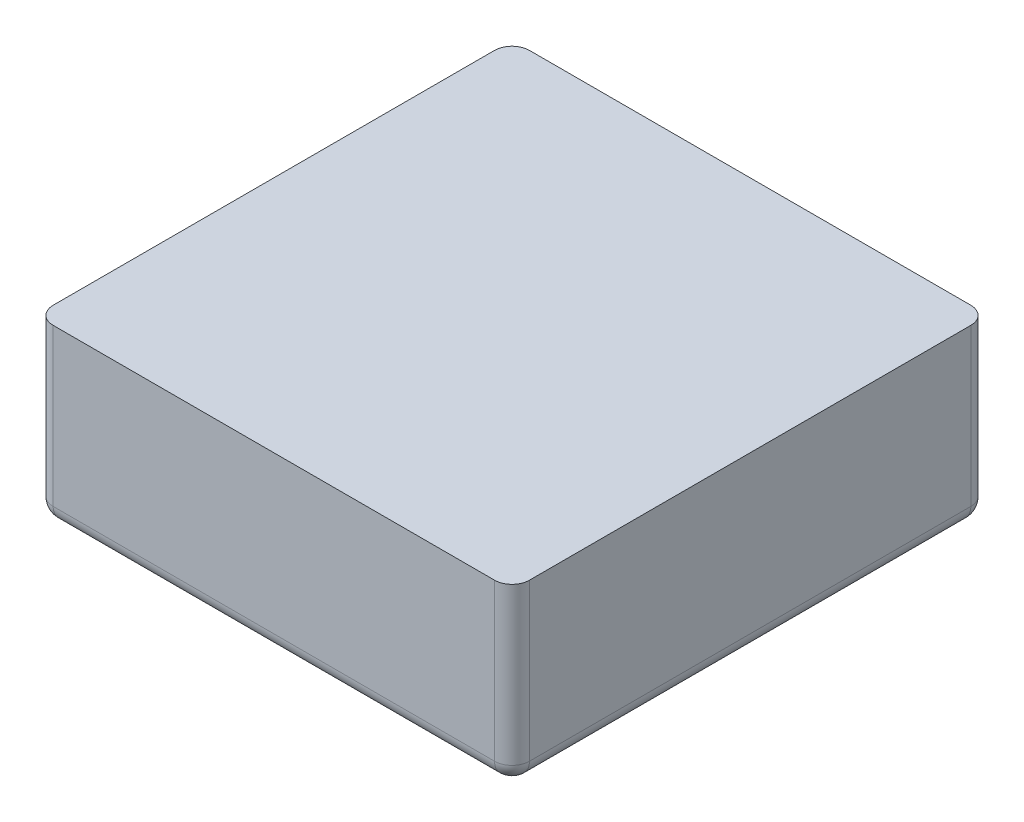
ISO-10303-21;
HEADER;
FILE_DESCRIPTION(('STEP AP214'),'2;1');
FILE_NAME('part.step','',(''),(''),'','','');
FILE_SCHEMA(('AUTOMOTIVE_DESIGN { 1 0 10303 214 1 1 1 1 }'));
ENDSEC;
DATA;
#1=APPLICATION_CONTEXT('core data for automotive mechanical design processes');
#2=APPLICATION_PROTOCOL_DEFINITION('international standard','automotive_design',2000,#1);
#3=PRODUCT_CONTEXT('',#1,'mechanical');
#4=PRODUCT('Part','Part','',(#3));
#5=PRODUCT_RELATED_PRODUCT_CATEGORY('part','',(#4));
#6=PRODUCT_DEFINITION_FORMATION('','',#4);
#7=PRODUCT_DEFINITION_CONTEXT('part definition',#1,'design');
#8=PRODUCT_DEFINITION('design','',#6,#7);
#9=PRODUCT_DEFINITION_SHAPE('','',#8);
#10=(LENGTH_UNIT() NAMED_UNIT(*) SI_UNIT(.MILLI.,.METRE.));
#11=(NAMED_UNIT(*) PLANE_ANGLE_UNIT() SI_UNIT($,.RADIAN.));
#12=(NAMED_UNIT(*) SI_UNIT($,.STERADIAN.) SOLID_ANGLE_UNIT());
#13=UNCERTAINTY_MEASURE_WITH_UNIT(LENGTH_MEASURE(1.E-05),#10,'distance_accuracy_value','');
#14=(GEOMETRIC_REPRESENTATION_CONTEXT(3) GLOBAL_UNCERTAINTY_ASSIGNED_CONTEXT((#13)) GLOBAL_UNIT_ASSIGNED_CONTEXT((#10,
#11,#12)) REPRESENTATION_CONTEXT('',''));
#15=CARTESIAN_POINT('',(0.,0.,0.));
#16=DIRECTION('',(0.,0.,1.));
#17=DIRECTION('',(1.,0.,0.));
#18=AXIS2_PLACEMENT_3D('',#15,#16,#17);
#19=CARTESIAN_POINT('',(37.8184373942661,11.45007019043,0.02539998851717));
#20=DIRECTION('',(4.371138828674E-08,-1.,0.));
#21=DIRECTION('',(1.,4.371138828674E-08,0.));
#22=AXIS2_PLACEMENT_3D('',#19,#20,#21);
#23=PLANE('',#22);
#24=DIRECTION('',(0.,0.,-1.));
#25=VECTOR('',#24,1.);
#26=CARTESIAN_POINT('',(38.1984373942661,11.4500702070403,0.805399988517169));
#27=LINE('',#26,#25);
#28=CARTESIAN_POINT('',(38.1984373942661,11.4500702070403,0.805399988517169));
#29=VERTEX_POINT('',#28);
#30=CARTESIAN_POINT('',(38.1984373942661,11.4500702070403,0.04539998851717));
#31=VERTEX_POINT('',#30);
#32=EDGE_CURVE('E169',#29,#31,#27,.T.);
#33=ORIENTED_EDGE('',*,*,#32,.F.);
#34=DIRECTION('',(1.,4.371138828674E-08,0.));
#35=VECTOR('',#34,1.);
#36=CARTESIAN_POINT('',(37.4384373942661,11.4500701738197,0.805399988517169));
#37=LINE('',#36,#35);
#38=CARTESIAN_POINT('',(37.4384373942661,11.4500701738197,0.805399988517169));
#39=VERTEX_POINT('',#38);
#40=EDGE_CURVE('E25',#39,#29,#37,.T.);
#41=ORIENTED_EDGE('',*,*,#40,.F.);
#42=DIRECTION('',(0.,0.,1.));
#43=VECTOR('',#42,1.);
#44=CARTESIAN_POINT('',(37.4384373942661,11.4500701738197,0.04539998851717));
#45=LINE('',#44,#43);
#46=CARTESIAN_POINT('',(37.4384373942661,11.4500701738197,0.04539998851717));
#47=VERTEX_POINT('',#46);
#48=EDGE_CURVE('E182',#47,#39,#45,.T.);
#49=ORIENTED_EDGE('',*,*,#48,.F.);
#50=DIRECTION('',(-1.,-4.371138828674E-08,0.));
#51=VECTOR('',#50,1.);
#52=CARTESIAN_POINT('',(38.1984373942661,11.4500702070403,0.04539998851717));
#53=LINE('',#52,#51);
#54=EDGE_CURVE('E189',#31,#47,#53,.T.);
#55=ORIENTED_EDGE('',*,*,#54,.F.);
#56=EDGE_LOOP('',(#33,#41,#49,#55));
#57=FACE_BOUND('',#56,.T.);
#58=ADVANCED_FACE('F16',(#57),#23,.T.);
#59=CARTESIAN_POINT('',(38.2284373942661,11.4500702083517,0.835399988517169));
#60=DIRECTION('',(0.,0.,-1.));
#61=DIRECTION('',(4.371138828674E-08,-1.,0.));
#62=AXIS2_PLACEMENT_3D('',#59,#60,#61);
#63=PLANE('',#62);
#64=DIRECTION('',(-4.371138828674E-08,1.,0.));
#65=VECTOR('',#64,1.);
#66=CARTESIAN_POINT('',(37.4384373929548,11.4800701738197,0.835399988517169));
#67=LINE('',#66,#65);
#68=CARTESIAN_POINT('',(37.4384373929548,11.4800701738197,0.835399988517169));
#69=VERTEX_POINT('',#68);
#70=CARTESIAN_POINT('',(37.4384373811526,11.7500701738197,0.835399988517169));
#71=VERTEX_POINT('',#70);
#72=EDGE_CURVE('E127',#69,#71,#67,.T.);
#73=ORIENTED_EDGE('',*,*,#72,.F.);
#74=DIRECTION('',(-1.,-4.371138828674E-08,0.));
#75=VECTOR('',#74,1.);
#76=CARTESIAN_POINT('',(38.1984373929547,11.4800702070403,0.835399988517169));
#77=LINE('',#76,#75);
#78=CARTESIAN_POINT('',(38.1984373929547,11.4800702070403,0.835399988517169));
#79=VERTEX_POINT('',#78);
#80=EDGE_CURVE('E11',#79,#69,#77,.T.);
#81=ORIENTED_EDGE('',*,*,#80,.F.);
#82=DIRECTION('',(4.371138828674E-08,-1.,0.));
#83=VECTOR('',#82,1.);
#84=CARTESIAN_POINT('',(38.1984373811526,11.7500702070403,0.835399988517169));
#85=LINE('',#84,#83);
#86=CARTESIAN_POINT('',(38.1984373811526,11.7500702070403,0.835399988517169));
#87=VERTEX_POINT('',#86);
#88=EDGE_CURVE('E129',#87,#79,#85,.T.);
#89=ORIENTED_EDGE('',*,*,#88,.F.);
#90=DIRECTION('',(1.,4.371138828674E-08,0.));
#91=VECTOR('',#90,1.);
#92=CARTESIAN_POINT('',(37.4384373811526,11.7500701738197,0.835399988517169));
#93=LINE('',#92,#91);
#94=EDGE_CURVE('E123',#71,#87,#93,.T.);
#95=ORIENTED_EDGE('',*,*,#94,.F.);
#96=EDGE_LOOP('',(#73,#81,#89,#95));
#97=FACE_BOUND('',#96,.T.);
#98=ADVANCED_FACE('F125',(#97),#63,.F.);
#99=CARTESIAN_POINT('',(37.8184373929547,11.48007019043,0.805399988517169));
#100=DIRECTION('',(1.,4.371138828674E-08,0.));
#101=DIRECTION('',(-4.371138828674E-08,1.,0.));
#102=AXIS2_PLACEMENT_3D('',#99,#100,#101);
#103=CYLINDRICAL_SURFACE('',#102,0.03);
#104=ORIENTED_EDGE('',*,*,#40,.T.);
#105=CARTESIAN_POINT('',(38.1984373929547,11.4800702070403,0.805399988517169));
#106=DIRECTION('',(1.,4.371138828674E-08,0.));
#107=DIRECTION('',(0.,0.,1.));
#108=AXIS2_PLACEMENT_3D('',#105,#106,#107);
#109=CIRCLE('',#108,0.03);
#110=EDGE_CURVE('E179',#79,#29,#109,.T.);
#111=ORIENTED_EDGE('',*,*,#110,.F.);
#112=ORIENTED_EDGE('',*,*,#80,.T.);
#113=CARTESIAN_POINT('',(37.4384373929548,11.4800701738197,0.805399988517169));
#114=DIRECTION('',(-1.,-4.371138828674E-08,0.));
#115=DIRECTION('',(4.371138828674E-08,-1.,0.));
#116=AXIS2_PLACEMENT_3D('',#113,#114,#115);
#117=CIRCLE('',#116,0.03);
#118=EDGE_CURVE('E263',#39,#69,#117,.T.);
#119=ORIENTED_EDGE('',*,*,#118,.F.);
#120=EDGE_LOOP('',(#104,#111,#112,#119));
#121=FACE_BOUND('',#120,.T.);
#122=ADVANCED_FACE('F343',(#121),#103,.T.);
#123=CARTESIAN_POINT('',(38.1984373929547,11.4800702070403,0.805399988517169));
#124=DIRECTION('',(-1.,-4.371138828674E-08,0.));
#125=DIRECTION('',(-4.371138828674E-08,1.,0.));
#126=AXIS2_PLACEMENT_3D('',#123,#124,#125);
#127=SPHERICAL_SURFACE('',#126,0.03);
#128=ORIENTED_EDGE('',*,*,#110,.T.);
#129=CARTESIAN_POINT('',(38.1984373929547,11.4800702070403,0.805399988517169));
#130=DIRECTION('',(0.,0.,1.));
#131=DIRECTION('',(4.371138828674E-08,-1.,0.));
#132=AXIS2_PLACEMENT_3D('',#129,#130,#131);
#133=CIRCLE('',#132,0.03);
#134=CARTESIAN_POINT('',(38.2284373929547,11.4800702083517,0.805399988517169));
#135=VERTEX_POINT('',#134);
#136=EDGE_CURVE('E174',#29,#135,#133,.T.);
#137=ORIENTED_EDGE('',*,*,#136,.T.);
#138=CARTESIAN_POINT('',(38.1984373929547,11.4800702070403,0.805399988517169));
#139=DIRECTION('',(4.371138828674E-08,-1.,0.));
#140=DIRECTION('',(1.,4.371138828674E-08,0.));
#141=AXIS2_PLACEMENT_3D('',#138,#139,#140);
#142=CIRCLE('',#141,0.03);
#143=EDGE_CURVE('E85',#135,#79,#142,.T.);
#144=ORIENTED_EDGE('',*,*,#143,.T.);
#145=EDGE_LOOP('',(#128,#137,#144));
#146=FACE_BOUND('',#145,.T.);
#147=ADVANCED_FACE('F353',(#146),#127,.T.);
#148=CARTESIAN_POINT('',(38.1984373942661,11.4500702070403,0.805399988517169));
#149=DIRECTION('',(-4.371138828674E-08,1.,0.));
#150=DIRECTION('',(-1.,-4.371138828674E-08,0.));
#151=AXIS2_PLACEMENT_3D('',#148,#149,#150);
#152=CYLINDRICAL_SURFACE('',#151,0.03);
#153=ORIENTED_EDGE('',*,*,#88,.T.);
#154=ORIENTED_EDGE('',*,*,#143,.F.);
#155=DIRECTION('',(-4.371138828674E-08,1.,0.));
#156=VECTOR('',#155,1.);
#157=CARTESIAN_POINT('',(38.2284373929547,11.4800702083517,0.805399988517169));
#158=LINE('',#157,#156);
#159=CARTESIAN_POINT('',(38.2284373811526,11.7500702083517,0.805399988517169));
#160=VERTEX_POINT('',#159);
#161=EDGE_CURVE('E242',#135,#160,#158,.T.);
#162=ORIENTED_EDGE('',*,*,#161,.T.);
#163=CARTESIAN_POINT('',(38.1984373811526,11.7500702070403,0.805399988517169));
#164=DIRECTION('',(-4.371138828674E-08,1.,0.));
#165=DIRECTION('',(0.,0.,1.));
#166=AXIS2_PLACEMENT_3D('',#163,#164,#165);
#167=CIRCLE('',#166,0.03);
#168=EDGE_CURVE('E133',#87,#160,#167,.T.);
#169=ORIENTED_EDGE('',*,*,#168,.F.);
#170=EDGE_LOOP('',(#153,#154,#162,#169));
#171=FACE_BOUND('',#170,.T.);
#172=ADVANCED_FACE('F359',(#171),#152,.T.);
#173=CARTESIAN_POINT('',(38.1984373942661,11.4500702070403,0.04539998851717));
#174=DIRECTION('',(-4.371138828674E-08,1.,0.));
#175=DIRECTION('',(-1.,-4.371138828674E-08,0.));
#176=AXIS2_PLACEMENT_3D('',#173,#174,#175);
#177=CYLINDRICAL_SURFACE('',#176,0.03);
#178=DIRECTION('',(4.371138828674E-08,-1.,0.));
#179=VECTOR('',#178,1.);
#180=CARTESIAN_POINT('',(38.2284373811526,11.7500702083517,0.04539998851717));
#181=LINE('',#180,#179);
#182=CARTESIAN_POINT('',(38.2284373811526,11.7500702083517,0.04539998851717));
#183=VERTEX_POINT('',#182);
#184=CARTESIAN_POINT('',(38.2284373929547,11.4800702083517,0.04539998851717));
#185=VERTEX_POINT('',#184);
#186=EDGE_CURVE('E218',#183,#185,#181,.T.);
#187=ORIENTED_EDGE('',*,*,#186,.T.);
#188=CARTESIAN_POINT('',(38.1984373929547,11.4800702070403,0.04539998851717));
#189=DIRECTION('',(4.371138828674E-08,-1.,0.));
#190=DIRECTION('',(0.,0.,-1.));
#191=AXIS2_PLACEMENT_3D('',#188,#189,#190);
#192=CIRCLE('',#191,0.03);
#193=CARTESIAN_POINT('',(38.1984373929547,11.4800702070403,0.01539998851717));
#194=VERTEX_POINT('',#193);
#195=EDGE_CURVE('E210',#194,#185,#192,.T.);
#196=ORIENTED_EDGE('',*,*,#195,.F.);
#197=DIRECTION('',(-4.371138828674E-08,1.,0.));
#198=VECTOR('',#197,1.);
#199=CARTESIAN_POINT('',(38.1984373929547,11.4800702070403,0.01539998851717));
#200=LINE('',#199,#198);
#201=CARTESIAN_POINT('',(38.1984373811526,11.7500702070403,0.01539998851717));
#202=VERTEX_POINT('',#201);
#203=EDGE_CURVE('E164',#194,#202,#200,.T.);
#204=ORIENTED_EDGE('',*,*,#203,.T.);
#205=CARTESIAN_POINT('',(38.1984373811526,11.7500702070403,0.04539998851717));
#206=DIRECTION('',(-4.371138828674E-08,1.,0.));
#207=DIRECTION('',(1.,4.371138828674E-08,0.));
#208=AXIS2_PLACEMENT_3D('',#205,#206,#207);
#209=CIRCLE('',#208,0.03);
#210=EDGE_CURVE('E235',#183,#202,#209,.T.);
#211=ORIENTED_EDGE('',*,*,#210,.F.);
#212=EDGE_LOOP('',(#187,#196,#204,#211));
#213=FACE_BOUND('',#212,.T.);
#214=ADVANCED_FACE('F336',(#213),#177,.T.);
#215=CARTESIAN_POINT('',(37.4084373942661,11.4500701725083,0.01539998851717));
#216=DIRECTION('',(0.,0.,1.));
#217=DIRECTION('',(-4.371138828674E-08,1.,0.));
#218=AXIS2_PLACEMENT_3D('',#215,#216,#217);
#219=PLANE('',#218);
#220=DIRECTION('',(4.371138828674E-08,-1.,0.));
#221=VECTOR('',#220,1.);
#222=CARTESIAN_POINT('',(37.4384373811526,11.7500701738197,0.01539998851717));
#223=LINE('',#222,#221);
#224=CARTESIAN_POINT('',(37.4384373811526,11.7500701738197,0.01539998851717));
#225=VERTEX_POINT('',#224);
#226=CARTESIAN_POINT('',(37.4384373929548,11.4800701738197,0.01539998851717));
#227=VERTEX_POINT('',#226);
#228=EDGE_CURVE('E232',#225,#227,#223,.T.);
#229=ORIENTED_EDGE('',*,*,#228,.F.);
#230=DIRECTION('',(-1.,-4.371138828674E-08,0.));
#231=VECTOR('',#230,1.);
#232=CARTESIAN_POINT('',(38.1984373811526,11.7500702070403,0.01539998851717));
#233=LINE('',#232,#231);
#234=EDGE_CURVE('E239',#202,#225,#233,.T.);
#235=ORIENTED_EDGE('',*,*,#234,.F.);
#236=ORIENTED_EDGE('',*,*,#203,.F.);
#237=DIRECTION('',(1.,4.371138828674E-08,0.));
#238=VECTOR('',#237,1.);
#239=CARTESIAN_POINT('',(37.4384373929548,11.4800701738197,0.01539998851717));
#240=LINE('',#239,#238);
#241=EDGE_CURVE('E193',#227,#194,#240,.T.);
#242=ORIENTED_EDGE('',*,*,#241,.F.);
#243=EDGE_LOOP('',(#229,#235,#236,#242));
#244=FACE_BOUND('',#243,.T.);
#245=ADVANCED_FACE('F324',(#244),#219,.F.);
#246=CARTESIAN_POINT('',(37.4384373942661,11.4500701738197,0.04539998851717));
#247=DIRECTION('',(-4.371138828674E-08,1.,0.));
#248=DIRECTION('',(-1.,-4.371138828674E-08,0.));
#249=AXIS2_PLACEMENT_3D('',#246,#247,#248);
#250=CYLINDRICAL_SURFACE('',#249,0.03);
#251=ORIENTED_EDGE('',*,*,#228,.T.);
#252=CARTESIAN_POINT('',(37.4384373929548,11.4800701738197,0.04539998851717));
#253=DIRECTION('',(4.371138828674E-08,-1.,0.));
#254=DIRECTION('',(-1.,-4.371138828674E-08,0.));
#255=AXIS2_PLACEMENT_3D('',#252,#253,#254);
#256=CIRCLE('',#255,0.03);
#257=CARTESIAN_POINT('',(37.4084373929547,11.4800701725083,0.04539998851717));
#258=VERTEX_POINT('',#257);
#259=EDGE_CURVE('E201',#258,#227,#256,.T.);
#260=ORIENTED_EDGE('',*,*,#259,.F.);
#261=DIRECTION('',(-4.371138828674E-08,1.,0.));
#262=VECTOR('',#261,1.);
#263=CARTESIAN_POINT('',(37.4084373929547,11.4800701725083,0.04539998851717));
#264=LINE('',#263,#262);
#265=CARTESIAN_POINT('',(37.4084373811526,11.7500701725083,0.04539998851717));
#266=VERTEX_POINT('',#265);
#267=EDGE_CURVE('E46',#258,#266,#264,.T.);
#268=ORIENTED_EDGE('',*,*,#267,.T.);
#269=CARTESIAN_POINT('',(37.4384373811526,11.7500701738197,0.04539998851717));
#270=DIRECTION('',(-4.371138828674E-08,1.,0.));
#271=DIRECTION('',(0.,0.,-1.));
#272=AXIS2_PLACEMENT_3D('',#269,#270,#271);
#273=CIRCLE('',#272,0.03);
#274=EDGE_CURVE('E293',#225,#266,#273,.T.);
#275=ORIENTED_EDGE('',*,*,#274,.F.);
#276=EDGE_LOOP('',(#251,#260,#268,#275));
#277=FACE_BOUND('',#276,.T.);
#278=ADVANCED_FACE('F325',(#277),#250,.T.);
#279=CARTESIAN_POINT('',(37.4084373942661,11.4500701725083,0.835399988517169));
#280=DIRECTION('',(1.,4.371138828674E-08,0.));
#281=DIRECTION('',(-4.371138828674E-08,1.,0.));
#282=AXIS2_PLACEMENT_3D('',#279,#280,#281);
#283=PLANE('',#282);
#284=DIRECTION('',(4.371138828674E-08,-1.,0.));
#285=VECTOR('',#284,1.);
#286=CARTESIAN_POINT('',(37.4084373811526,11.7500701725083,0.805399988517169));
#287=LINE('',#286,#285);
#288=CARTESIAN_POINT('',(37.4084373811526,11.7500701725083,0.805399988517169));
#289=VERTEX_POINT('',#288);
#290=CARTESIAN_POINT('',(37.4084373929547,11.4800701725083,0.805399988517169));
#291=VERTEX_POINT('',#290);
#292=EDGE_CURVE('E149',#289,#291,#287,.T.);
#293=ORIENTED_EDGE('',*,*,#292,.F.);
#294=DIRECTION('',(0.,0.,1.));
#295=VECTOR('',#294,1.);
#296=CARTESIAN_POINT('',(37.4084373811526,11.7500701725083,0.04539998851717));
#297=LINE('',#296,#295);
#298=EDGE_CURVE('E139',#266,#289,#297,.T.);
#299=ORIENTED_EDGE('',*,*,#298,.F.);
#300=ORIENTED_EDGE('',*,*,#267,.F.);
#301=DIRECTION('',(0.,0.,-1.));
#302=VECTOR('',#301,1.);
#303=CARTESIAN_POINT('',(37.4084373929547,11.4800701725083,0.805399988517169));
#304=LINE('',#303,#302);
#305=EDGE_CURVE('E187',#291,#258,#304,.T.);
#306=ORIENTED_EDGE('',*,*,#305,.F.);
#307=EDGE_LOOP('',(#293,#299,#300,#306));
#308=FACE_BOUND('',#307,.T.);
#309=ADVANCED_FACE('F327',(#308),#283,.F.);
#310=CARTESIAN_POINT('',(37.8184373811526,11.75007019043,0.02539998851717));
#311=DIRECTION('',(4.371138828674E-08,-1.,0.));
#312=DIRECTION('',(1.,4.371138828674E-08,0.));
#313=AXIS2_PLACEMENT_3D('',#310,#311,#312);
#314=PLANE('',#313);
#315=CARTESIAN_POINT('',(37.4384373811526,11.7500701738197,0.805399988517169));
#316=DIRECTION('',(-4.371138828674E-08,1.,0.));
#317=DIRECTION('',(-1.,-4.371138828674E-08,0.));
#318=AXIS2_PLACEMENT_3D('',#315,#316,#317);
#319=CIRCLE('',#318,0.03);
#320=EDGE_CURVE('E134',#289,#71,#319,.T.);
#321=ORIENTED_EDGE('',*,*,#320,.T.);
#322=ORIENTED_EDGE('',*,*,#94,.T.);
#323=ORIENTED_EDGE('',*,*,#168,.T.);
#324=DIRECTION('',(0.,0.,-1.));
#325=VECTOR('',#324,1.);
#326=CARTESIAN_POINT('',(38.2284373811526,11.7500702083517,0.805399988517169));
#327=LINE('',#326,#325);
#328=EDGE_CURVE('E222',#160,#183,#327,.T.);
#329=ORIENTED_EDGE('',*,*,#328,.T.);
#330=ORIENTED_EDGE('',*,*,#210,.T.);
#331=ORIENTED_EDGE('',*,*,#234,.T.);
#332=ORIENTED_EDGE('',*,*,#274,.T.);
#333=ORIENTED_EDGE('',*,*,#298,.T.);
#334=EDGE_LOOP('',(#321,#322,#323,#329,#330,#331,#332,#333));
#335=FACE_BOUND('',#334,.T.);
#336=ADVANCED_FACE('F137',(#335),#314,.F.);
#337=CARTESIAN_POINT('',(37.4384373942661,11.4500701738197,0.805399988517169));
#338=DIRECTION('',(-4.371138828674E-08,1.,0.));
#339=DIRECTION('',(-1.,-4.371138828674E-08,0.));
#340=AXIS2_PLACEMENT_3D('',#337,#338,#339);
#341=CYLINDRICAL_SURFACE('',#340,0.03);
#342=ORIENTED_EDGE('',*,*,#292,.T.);
#343=CARTESIAN_POINT('',(37.4384373929548,11.4800701738197,0.805399988517169));
#344=DIRECTION('',(4.371138828674E-08,-1.,0.));
#345=DIRECTION('',(0.,0.,1.));
#346=AXIS2_PLACEMENT_3D('',#343,#344,#345);
#347=CIRCLE('',#346,0.03);
#348=EDGE_CURVE('E146',#69,#291,#347,.T.);
#349=ORIENTED_EDGE('',*,*,#348,.F.);
#350=ORIENTED_EDGE('',*,*,#72,.T.);
#351=ORIENTED_EDGE('',*,*,#320,.F.);
#352=EDGE_LOOP('',(#342,#349,#350,#351));
#353=FACE_BOUND('',#352,.T.);
#354=ADVANCED_FACE('F144',(#353),#341,.T.);
#355=CARTESIAN_POINT('',(37.4384373929548,11.4800701738197,0.805399988517169));
#356=DIRECTION('',(-1.,-4.371138828674E-08,0.));
#357=DIRECTION('',(-4.371138828674E-08,1.,0.));
#358=AXIS2_PLACEMENT_3D('',#355,#356,#357);
#359=SPHERICAL_SURFACE('',#358,0.03);
#360=CARTESIAN_POINT('',(37.4384373929548,11.4800701738197,0.805399988517169));
#361=DIRECTION('',(0.,0.,1.));
#362=DIRECTION('',(-1.,-4.371138828674E-08,0.));
#363=AXIS2_PLACEMENT_3D('',#360,#361,#362);
#364=CIRCLE('',#363,0.03);
#365=EDGE_CURVE('E186',#291,#39,#364,.T.);
#366=ORIENTED_EDGE('',*,*,#365,.T.);
#367=ORIENTED_EDGE('',*,*,#118,.T.);
#368=ORIENTED_EDGE('',*,*,#348,.T.);
#369=EDGE_LOOP('',(#366,#367,#368));
#370=FACE_BOUND('',#369,.T.);
#371=ADVANCED_FACE('F413',(#370),#359,.T.);
#372=CARTESIAN_POINT('',(37.4384373929548,11.4800701738197,0.02539998851717));
#373=DIRECTION('',(0.,0.,1.));
#374=DIRECTION('',(-4.371138828674E-08,1.,0.));
#375=AXIS2_PLACEMENT_3D('',#372,#373,#374);
#376=CYLINDRICAL_SURFACE('',#375,0.03);
#377=ORIENTED_EDGE('',*,*,#305,.T.);
#378=CARTESIAN_POINT('',(37.4384373929548,11.4800701738197,0.04539998851717));
#379=DIRECTION('',(0.,0.,-1.));
#380=DIRECTION('',(4.371138828674E-08,-1.,0.));
#381=AXIS2_PLACEMENT_3D('',#378,#379,#380);
#382=CIRCLE('',#381,0.03);
#383=EDGE_CURVE('E299',#47,#258,#382,.T.);
#384=ORIENTED_EDGE('',*,*,#383,.F.);
#385=ORIENTED_EDGE('',*,*,#48,.T.);
#386=ORIENTED_EDGE('',*,*,#365,.F.);
#387=EDGE_LOOP('',(#377,#384,#385,#386));
#388=FACE_BOUND('',#387,.T.);
#389=ADVANCED_FACE('F411',(#388),#376,.T.);
#390=CARTESIAN_POINT('',(37.4384373929548,11.4800701738197,0.04539998851717));
#391=DIRECTION('',(-1.,-4.371138828674E-08,0.));
#392=DIRECTION('',(-4.371138828674E-08,1.,0.));
#393=AXIS2_PLACEMENT_3D('',#390,#391,#392);
#394=SPHERICAL_SURFACE('',#393,0.03);
#395=ORIENTED_EDGE('',*,*,#259,.T.);
#396=CARTESIAN_POINT('',(37.4384373929548,11.4800701738197,0.04539998851717));
#397=DIRECTION('',(-1.,-4.371138828674E-08,0.));
#398=DIRECTION('',(0.,0.,-1.));
#399=AXIS2_PLACEMENT_3D('',#396,#397,#398);
#400=CIRCLE('',#399,0.03);
#401=EDGE_CURVE('E192',#227,#47,#400,.T.);
#402=ORIENTED_EDGE('',*,*,#401,.T.);
#403=ORIENTED_EDGE('',*,*,#383,.T.);
#404=EDGE_LOOP('',(#395,#402,#403));
#405=FACE_BOUND('',#404,.T.);
#406=ADVANCED_FACE('F409',(#405),#394,.T.);
#407=CARTESIAN_POINT('',(37.8184373929547,11.48007019043,0.04539998851717));
#408=DIRECTION('',(-1.,-4.371138828674E-08,0.));
#409=DIRECTION('',(4.371138828674E-08,-1.,0.));
#410=AXIS2_PLACEMENT_3D('',#407,#408,#409);
#411=CYLINDRICAL_SURFACE('',#410,0.03);
#412=ORIENTED_EDGE('',*,*,#241,.T.);
#413=CARTESIAN_POINT('',(38.1984373929547,11.4800702070403,0.04539998851717));
#414=DIRECTION('',(1.,4.371138828674E-08,0.));
#415=DIRECTION('',(4.371138828674E-08,-1.,0.));
#416=AXIS2_PLACEMENT_3D('',#413,#414,#415);
#417=CIRCLE('',#416,0.03);
#418=EDGE_CURVE('E204',#31,#194,#417,.T.);
#419=ORIENTED_EDGE('',*,*,#418,.F.);
#420=ORIENTED_EDGE('',*,*,#54,.T.);
#421=ORIENTED_EDGE('',*,*,#401,.F.);
#422=EDGE_LOOP('',(#412,#419,#420,#421));
#423=FACE_BOUND('',#422,.T.);
#424=ADVANCED_FACE('F460',(#423),#411,.T.);
#425=CARTESIAN_POINT('',(38.1984373929547,11.4800702070403,0.04539998851717));
#426=DIRECTION('',(-1.,-4.371138828674E-08,0.));
#427=DIRECTION('',(-4.371138828674E-08,1.,0.));
#428=AXIS2_PLACEMENT_3D('',#425,#426,#427);
#429=SPHERICAL_SURFACE('',#428,0.03);
#430=ORIENTED_EDGE('',*,*,#195,.T.);
#431=CARTESIAN_POINT('',(38.1984373929547,11.4800702070403,0.04539998851717));
#432=DIRECTION('',(0.,0.,-1.));
#433=DIRECTION('',(1.,4.371138828674E-08,0.));
#434=AXIS2_PLACEMENT_3D('',#431,#432,#433);
#435=CIRCLE('',#434,0.03);
#436=EDGE_CURVE('E173',#185,#31,#435,.T.);
#437=ORIENTED_EDGE('',*,*,#436,.T.);
#438=ORIENTED_EDGE('',*,*,#418,.T.);
#439=EDGE_LOOP('',(#430,#437,#438));
#440=FACE_BOUND('',#439,.T.);
#441=ADVANCED_FACE('F469',(#440),#429,.T.);
#442=CARTESIAN_POINT('',(38.1984373929547,11.4800702070403,0.02539998851717));
#443=DIRECTION('',(0.,0.,-1.));
#444=DIRECTION('',(4.371138828674E-08,-1.,0.));
#445=AXIS2_PLACEMENT_3D('',#442,#443,#444);
#446=CYLINDRICAL_SURFACE('',#445,0.03);
#447=DIRECTION('',(0.,0.,1.));
#448=VECTOR('',#447,1.);
#449=CARTESIAN_POINT('',(38.2284373929547,11.4800702083517,0.04539998851717));
#450=LINE('',#449,#448);
#451=EDGE_CURVE('E245',#185,#135,#450,.T.);
#452=ORIENTED_EDGE('',*,*,#451,.T.);
#453=ORIENTED_EDGE('',*,*,#136,.F.);
#454=ORIENTED_EDGE('',*,*,#32,.T.);
#455=ORIENTED_EDGE('',*,*,#436,.F.);
#456=EDGE_LOOP('',(#452,#453,#454,#455));
#457=FACE_BOUND('',#456,.T.);
#458=ADVANCED_FACE('F349',(#457),#446,.T.);
#459=CARTESIAN_POINT('',(38.2284373942661,11.4500702083517,0.01539998851717));
#460=DIRECTION('',(-1.,-4.371138828674E-08,0.));
#461=DIRECTION('',(4.371138828674E-08,-1.,0.));
#462=AXIS2_PLACEMENT_3D('',#459,#460,#461);
#463=PLANE('',#462);
#464=ORIENTED_EDGE('',*,*,#186,.F.);
#465=ORIENTED_EDGE('',*,*,#328,.F.);
#466=ORIENTED_EDGE('',*,*,#161,.F.);
#467=ORIENTED_EDGE('',*,*,#451,.F.);
#468=EDGE_LOOP('',(#464,#465,#466,#467));
#469=FACE_BOUND('',#468,.T.);
#470=ADVANCED_FACE('F373',(#469),#463,.F.);
#471=CLOSED_SHELL('',(#58,#98,#122,#147,#172,#214,#245,#278,#309,#336,#354,#371,#389,#406,#424,
#441,#458,#470));
#472=MANIFOLD_SOLID_BREP('B1',#471);
#473=ADVANCED_BREP_SHAPE_REPRESENTATION('',(#18,#472),#14);
#474=SHAPE_DEFINITION_REPRESENTATION(#9,#473);
ENDSEC;
END-ISO-10303-21;
